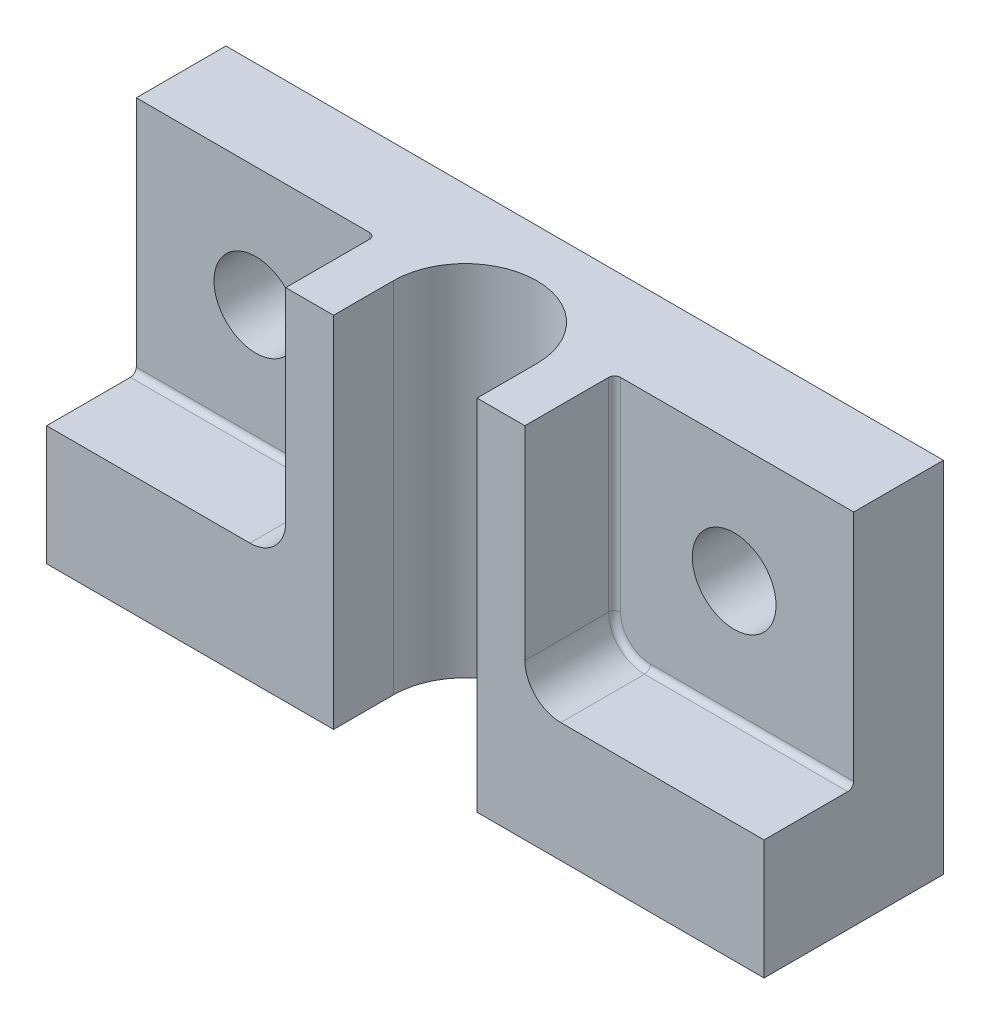
ISO-10303-21;
HEADER;
FILE_DESCRIPTION(('STEP AP214'),'2;1');
FILE_NAME('part.step','',(''),(''),'','','');
FILE_SCHEMA(('AUTOMOTIVE_DESIGN { 1 0 10303 214 1 1 1 1 }'));
ENDSEC;
DATA;
#1=APPLICATION_CONTEXT('core data for automotive mechanical design processes');
#2=APPLICATION_PROTOCOL_DEFINITION('international standard','automotive_design',2000,#1);
#3=PRODUCT_CONTEXT('',#1,'mechanical');
#4=PRODUCT('Part','Part','',(#3));
#5=PRODUCT_RELATED_PRODUCT_CATEGORY('part','',(#4));
#6=PRODUCT_DEFINITION_FORMATION('','',#4);
#7=PRODUCT_DEFINITION_CONTEXT('part definition',#1,'design');
#8=PRODUCT_DEFINITION('design','',#6,#7);
#9=PRODUCT_DEFINITION_SHAPE('','',#8);
#10=(LENGTH_UNIT() NAMED_UNIT(*) SI_UNIT(.MILLI.,.METRE.));
#11=(NAMED_UNIT(*) PLANE_ANGLE_UNIT() SI_UNIT($,.RADIAN.));
#12=(NAMED_UNIT(*) SI_UNIT($,.STERADIAN.) SOLID_ANGLE_UNIT());
#13=UNCERTAINTY_MEASURE_WITH_UNIT(LENGTH_MEASURE(1.E-05),#10,'distance_accuracy_value','');
#14=(GEOMETRIC_REPRESENTATION_CONTEXT(3) GLOBAL_UNCERTAINTY_ASSIGNED_CONTEXT((#13)) GLOBAL_UNIT_ASSIGNED_CONTEXT((#10,
#11,#12)) REPRESENTATION_CONTEXT('',''));
#15=CARTESIAN_POINT('',(0.,0.,0.));
#16=DIRECTION('',(0.,0.,1.));
#17=DIRECTION('',(1.,0.,0.));
#18=AXIS2_PLACEMENT_3D('',#15,#16,#17);
#19=CARTESIAN_POINT('',(-30.,-30.,0.));
#20=DIRECTION('',(0.,0.,1.));
#21=DIRECTION('',(1.,0.,0.));
#22=AXIS2_PLACEMENT_3D('',#19,#20,#21);
#23=PLANE('',#22);
#24=DIRECTION('',(0.,1.,0.));
#25=VECTOR('',#24,1.);
#26=CARTESIAN_POINT('',(-6.,-30.,0.));
#27=LINE('',#26,#25);
#28=CARTESIAN_POINT('',(-6.,-30.,0.));
#29=VERTEX_POINT('',#28);
#30=CARTESIAN_POINT('',(-6.,0.,0.));
#31=VERTEX_POINT('',#30);
#32=EDGE_CURVE('E211',#29,#31,#27,.T.);
#33=ORIENTED_EDGE('',*,*,#32,.T.);
#34=DIRECTION('',(-1.,0.,0.));
#35=VECTOR('',#34,1.);
#36=CARTESIAN_POINT('',(-30.,0.,0.));
#37=LINE('',#36,#35);
#38=CARTESIAN_POINT('',(-10.,0.,0.));
#39=VERTEX_POINT('',#38);
#40=EDGE_CURVE('E290',#31,#39,#37,.T.);
#41=ORIENTED_EDGE('',*,*,#40,.T.);
#42=DIRECTION('',(0.,1.,0.));
#43=VECTOR('',#42,1.);
#44=CARTESIAN_POINT('',(-10.,-17.,0.));
#45=LINE('',#44,#43);
#46=CARTESIAN_POINT('',(-10.,-17.,0.));
#47=VERTEX_POINT('',#46);
#48=EDGE_CURVE('E226',#47,#39,#45,.T.);
#49=ORIENTED_EDGE('',*,*,#48,.F.);
#50=CARTESIAN_POINT('',(-13.,-17.,0.));
#51=DIRECTION('',(0.,0.,1.));
#52=DIRECTION('',(1.,0.,0.));
#53=AXIS2_PLACEMENT_3D('',#50,#51,#52);
#54=CIRCLE('',#53,3.);
#55=CARTESIAN_POINT('',(-13.,-20.,0.));
#56=VERTEX_POINT('',#55);
#57=EDGE_CURVE('E214',#56,#47,#54,.T.);
#58=ORIENTED_EDGE('',*,*,#57,.F.);
#59=DIRECTION('',(1.,0.,0.));
#60=VECTOR('',#59,1.);
#61=CARTESIAN_POINT('',(-13.,-20.,0.));
#62=LINE('',#61,#60);
#63=CARTESIAN_POINT('',(-30.,-20.,0.));
#64=VERTEX_POINT('',#63);
#65=EDGE_CURVE('E220',#64,#56,#62,.T.);
#66=ORIENTED_EDGE('',*,*,#65,.F.);
#67=DIRECTION('',(0.,-1.,0.));
#68=VECTOR('',#67,1.);
#69=CARTESIAN_POINT('',(-30.,0.,0.));
#70=LINE('',#69,#68);
#71=CARTESIAN_POINT('',(-30.,-30.,0.));
#72=VERTEX_POINT('',#71);
#73=EDGE_CURVE('E268',#64,#72,#70,.T.);
#74=ORIENTED_EDGE('',*,*,#73,.T.);
#75=DIRECTION('',(1.,0.,0.));
#76=VECTOR('',#75,1.);
#77=CARTESIAN_POINT('',(-30.,-30.,0.));
#78=LINE('',#77,#76);
#79=EDGE_CURVE('E284',#72,#29,#78,.T.);
#80=ORIENTED_EDGE('',*,*,#79,.T.);
#81=EDGE_LOOP('',(#33,#41,#49,#58,#66,#74,#80));
#82=FACE_BOUND('',#81,.T.);
#83=ADVANCED_FACE('F38',(#82),#23,.T.);
#84=CARTESIAN_POINT('',(-20.,-10.0000000000003,-15.));
#85=DIRECTION('',(0.,0.,1.));
#86=DIRECTION('',(1.,0.,0.));
#87=AXIS2_PLACEMENT_3D('',#84,#85,#86);
#88=CYLINDRICAL_SURFACE('',#87,3.5);
#89=CARTESIAN_POINT('',(-20.,-10.0000000000003,-15.));
#90=DIRECTION('',(0.,0.,1.));
#91=DIRECTION('',(1.,0.,0.));
#92=AXIS2_PLACEMENT_3D('',#89,#90,#91);
#93=CIRCLE('',#92,3.5);
#94=CARTESIAN_POINT('',(-16.5,-10.0000000000003,-15.));
#95=VERTEX_POINT('',#94);
#96=EDGE_CURVE('E262',#95,#95,#93,.T.);
#97=ORIENTED_EDGE('',*,*,#96,.F.);
#98=EDGE_LOOP('',(#97));
#99=FACE_BOUND('',#98,.T.);
#100=CARTESIAN_POINT('',(-20.,-10.0000000000003,-7.5));
#101=DIRECTION('',(0.,0.,1.));
#102=DIRECTION('',(1.,0.,0.));
#103=AXIS2_PLACEMENT_3D('',#100,#101,#102);
#104=CIRCLE('',#103,3.5);
#105=CARTESIAN_POINT('',(-16.5,-10.0000000000003,-7.5));
#106=VERTEX_POINT('',#105);
#107=EDGE_CURVE('E233',#106,#106,#104,.F.);
#108=ORIENTED_EDGE('',*,*,#107,.F.);
#109=EDGE_LOOP('',(#108));
#110=FACE_BOUND('',#109,.T.);
#111=ADVANCED_FACE('F434',(#99,#110),#88,.F.);
#112=CARTESIAN_POINT('',(-30.,0.,-15.));
#113=DIRECTION('',(-1.,0.,0.));
#114=DIRECTION('',(0.,-1.,0.));
#115=AXIS2_PLACEMENT_3D('',#112,#113,#114);
#116=PLANE('',#115);
#117=DIRECTION('',(0.,0.,1.));
#118=VECTOR('',#117,1.);
#119=CARTESIAN_POINT('',(-30.,-20.,-7.5));
#120=LINE('',#119,#118);
#121=CARTESIAN_POINT('',(-30.,-20.,-7.));
#122=VERTEX_POINT('',#121);
#123=EDGE_CURVE('E234',#122,#64,#120,.T.);
#124=ORIENTED_EDGE('',*,*,#123,.F.);
#125=CARTESIAN_POINT('',(-30.,-19.5,-7.));
#126=DIRECTION('',(-1.,0.,0.));
#127=DIRECTION('',(0.,-1.,0.));
#128=AXIS2_PLACEMENT_3D('',#125,#126,#127);
#129=CIRCLE('',#128,0.5);
#130=CARTESIAN_POINT('',(-30.,-19.5,-7.5));
#131=VERTEX_POINT('',#130);
#132=EDGE_CURVE('E47',#122,#131,#129,.F.);
#133=ORIENTED_EDGE('',*,*,#132,.T.);
#134=DIRECTION('',(0.,-1.,0.));
#135=VECTOR('',#134,1.);
#136=CARTESIAN_POINT('',(-30.,-20.,-7.5));
#137=LINE('',#136,#135);
#138=CARTESIAN_POINT('',(-30.,0.,-7.5));
#139=VERTEX_POINT('',#138);
#140=EDGE_CURVE('E219',#139,#131,#137,.T.);
#141=ORIENTED_EDGE('',*,*,#140,.F.);
#142=DIRECTION('',(0.,0.,1.));
#143=VECTOR('',#142,1.);
#144=CARTESIAN_POINT('',(-30.,0.,-15.));
#145=LINE('',#144,#143);
#146=CARTESIAN_POINT('',(-30.,0.,-15.));
#147=VERTEX_POINT('',#146);
#148=EDGE_CURVE('E293',#147,#139,#145,.T.);
#149=ORIENTED_EDGE('',*,*,#148,.F.);
#150=DIRECTION('',(0.,-1.,0.));
#151=VECTOR('',#150,1.);
#152=CARTESIAN_POINT('',(-30.,0.,-15.));
#153=LINE('',#152,#151);
#154=CARTESIAN_POINT('',(-30.,-30.,-15.));
#155=VERTEX_POINT('',#154);
#156=EDGE_CURVE('E269',#147,#155,#153,.T.);
#157=ORIENTED_EDGE('',*,*,#156,.T.);
#158=DIRECTION('',(0.,0.,1.));
#159=VECTOR('',#158,1.);
#160=CARTESIAN_POINT('',(-30.,-30.,-15.));
#161=LINE('',#160,#159);
#162=EDGE_CURVE('E282',#155,#72,#161,.T.);
#163=ORIENTED_EDGE('',*,*,#162,.T.);
#164=ORIENTED_EDGE('',*,*,#73,.F.);
#165=EDGE_LOOP('',(#124,#133,#141,#149,#157,#163,#164));
#166=FACE_BOUND('',#165,.T.);
#167=ADVANCED_FACE('F389',(#166),#116,.T.);
#168=CARTESIAN_POINT('',(-30.,0.,-15.));
#169=DIRECTION('',(0.,1.,0.));
#170=DIRECTION('',(0.,0.,1.));
#171=AXIS2_PLACEMENT_3D('',#168,#169,#170);
#172=PLANE('',#171);
#173=DIRECTION('',(0.,0.,1.));
#174=VECTOR('',#173,1.);
#175=CARTESIAN_POINT('',(-6.,0.,0.));
#176=LINE('',#175,#174);
#177=CARTESIAN_POINT('',(-6.,0.,-5.));
#178=VERTEX_POINT('',#177);
#179=EDGE_CURVE('E202',#178,#31,#176,.T.);
#180=ORIENTED_EDGE('',*,*,#179,.F.);
#181=CARTESIAN_POINT('',(0.,0.,-5.));
#182=DIRECTION('',(0.,1.,0.));
#183=DIRECTION('',(0.,0.,1.));
#184=AXIS2_PLACEMENT_3D('',#181,#182,#183);
#185=CIRCLE('',#184,6.);
#186=CARTESIAN_POINT('',(6.,0.,-5.));
#187=VERTEX_POINT('',#186);
#188=EDGE_CURVE('E204',#187,#178,#185,.T.);
#189=ORIENTED_EDGE('',*,*,#188,.F.);
#190=DIRECTION('',(0.,0.,-1.));
#191=VECTOR('',#190,1.);
#192=CARTESIAN_POINT('',(6.,0.,0.));
#193=LINE('',#192,#191);
#194=CARTESIAN_POINT('',(6.,0.,0.));
#195=VERTEX_POINT('',#194);
#196=EDGE_CURVE('E183',#195,#187,#193,.T.);
#197=ORIENTED_EDGE('',*,*,#196,.F.);
#198=CARTESIAN_POINT('',(10.,0.,0.));
#199=VERTEX_POINT('',#198);
#200=EDGE_CURVE('E273',#199,#195,#37,.T.);
#201=ORIENTED_EDGE('',*,*,#200,.F.);
#202=DIRECTION('',(0.,0.,1.));
#203=VECTOR('',#202,1.);
#204=CARTESIAN_POINT('',(10.,0.,-7.5));
#205=LINE('',#204,#203);
#206=CARTESIAN_POINT('',(10.,0.,-7.));
#207=VERTEX_POINT('',#206);
#208=EDGE_CURVE('E245',#207,#199,#205,.T.);
#209=ORIENTED_EDGE('',*,*,#208,.F.);
#210=CARTESIAN_POINT('',(10.5,0.,-7.));
#211=DIRECTION('',(0.,1.,0.));
#212=DIRECTION('',(0.,0.,1.));
#213=AXIS2_PLACEMENT_3D('',#210,#211,#212);
#214=CIRCLE('',#213,0.5);
#215=CARTESIAN_POINT('',(10.5,0.,-7.5));
#216=VERTEX_POINT('',#215);
#217=EDGE_CURVE('E334',#207,#216,#214,.F.);
#218=ORIENTED_EDGE('',*,*,#217,.T.);
#219=DIRECTION('',(-1.,0.,0.));
#220=VECTOR('',#219,1.);
#221=CARTESIAN_POINT('',(10.,0.,-7.5));
#222=LINE('',#221,#220);
#223=CARTESIAN_POINT('',(30.,0.,-7.5));
#224=VERTEX_POINT('',#223);
#225=EDGE_CURVE('E241',#224,#216,#222,.T.);
#226=ORIENTED_EDGE('',*,*,#225,.F.);
#227=DIRECTION('',(0.,0.,1.));
#228=VECTOR('',#227,1.);
#229=CARTESIAN_POINT('',(30.,0.,-15.));
#230=LINE('',#229,#228);
#231=CARTESIAN_POINT('',(30.,0.,-15.));
#232=VERTEX_POINT('',#231);
#233=EDGE_CURVE('E297',#232,#224,#230,.T.);
#234=ORIENTED_EDGE('',*,*,#233,.F.);
#235=DIRECTION('',(-1.,0.,0.));
#236=VECTOR('',#235,1.);
#237=CARTESIAN_POINT('',(-30.,0.,-15.));
#238=LINE('',#237,#236);
#239=EDGE_CURVE('E279',#232,#147,#238,.T.);
#240=ORIENTED_EDGE('',*,*,#239,.T.);
#241=ORIENTED_EDGE('',*,*,#148,.T.);
#242=DIRECTION('',(-1.,0.,0.));
#243=VECTOR('',#242,1.);
#244=CARTESIAN_POINT('',(-10.,0.,-7.5));
#245=LINE('',#244,#243);
#246=CARTESIAN_POINT('',(-10.5,0.,-7.5));
#247=VERTEX_POINT('',#246);
#248=EDGE_CURVE('E217',#247,#139,#245,.T.);
#249=ORIENTED_EDGE('',*,*,#248,.F.);
#250=CARTESIAN_POINT('',(-10.5,0.,-7.));
#251=DIRECTION('',(0.,1.,0.));
#252=DIRECTION('',(0.,0.,1.));
#253=AXIS2_PLACEMENT_3D('',#250,#251,#252);
#254=CIRCLE('',#253,0.5);
#255=CARTESIAN_POINT('',(-10.,0.,-7.));
#256=VERTEX_POINT('',#255);
#257=EDGE_CURVE('E332',#247,#256,#254,.F.);
#258=ORIENTED_EDGE('',*,*,#257,.T.);
#259=DIRECTION('',(0.,0.,1.));
#260=VECTOR('',#259,1.);
#261=CARTESIAN_POINT('',(-10.,0.,-7.5));
#262=LINE('',#261,#260);
#263=EDGE_CURVE('E236',#256,#39,#262,.T.);
#264=ORIENTED_EDGE('',*,*,#263,.T.);
#265=ORIENTED_EDGE('',*,*,#40,.F.);
#266=EDGE_LOOP('',(#180,#189,#197,#201,#209,#218,#226,#234,#240,#241,#249,#258,#264,#265));
#267=FACE_BOUND('',#266,.T.);
#268=ADVANCED_FACE('F364',(#267),#172,.T.);
#269=CARTESIAN_POINT('',(30.,0.,-15.));
#270=DIRECTION('',(1.,0.,0.));
#271=DIRECTION('',(0.,1.,0.));
#272=AXIS2_PLACEMENT_3D('',#269,#270,#271);
#273=PLANE('',#272);
#274=DIRECTION('',(0.,1.,0.));
#275=VECTOR('',#274,1.);
#276=CARTESIAN_POINT('',(30.,-20.,-7.5));
#277=LINE('',#276,#275);
#278=CARTESIAN_POINT('',(30.,-19.5,-7.5));
#279=VERTEX_POINT('',#278);
#280=EDGE_CURVE('E239',#279,#224,#277,.T.);
#281=ORIENTED_EDGE('',*,*,#280,.F.);
#282=CARTESIAN_POINT('',(30.,-19.5,-7.));
#283=DIRECTION('',(1.,0.,0.));
#284=DIRECTION('',(0.,1.,0.));
#285=AXIS2_PLACEMENT_3D('',#282,#283,#284);
#286=CIRCLE('',#285,0.5);
#287=CARTESIAN_POINT('',(30.,-20.,-7.));
#288=VERTEX_POINT('',#287);
#289=EDGE_CURVE('E11',#279,#288,#286,.F.);
#290=ORIENTED_EDGE('',*,*,#289,.T.);
#291=DIRECTION('',(0.,0.,1.));
#292=VECTOR('',#291,1.);
#293=CARTESIAN_POINT('',(30.,-20.,-7.5));
#294=LINE('',#293,#292);
#295=CARTESIAN_POINT('',(30.,-20.,0.));
#296=VERTEX_POINT('',#295);
#297=EDGE_CURVE('E254',#288,#296,#294,.T.);
#298=ORIENTED_EDGE('',*,*,#297,.T.);
#299=DIRECTION('',(0.,1.,0.));
#300=VECTOR('',#299,1.);
#301=CARTESIAN_POINT('',(30.,0.,0.));
#302=LINE('',#301,#300);
#303=CARTESIAN_POINT('',(30.,-30.,0.));
#304=VERTEX_POINT('',#303);
#305=EDGE_CURVE('E287',#304,#296,#302,.T.);
#306=ORIENTED_EDGE('',*,*,#305,.F.);
#307=DIRECTION('',(0.,0.,1.));
#308=VECTOR('',#307,1.);
#309=CARTESIAN_POINT('',(30.,-30.,-15.));
#310=LINE('',#309,#308);
#311=CARTESIAN_POINT('',(30.,-30.,-15.));
#312=VERTEX_POINT('',#311);
#313=EDGE_CURVE('E300',#312,#304,#310,.T.);
#314=ORIENTED_EDGE('',*,*,#313,.F.);
#315=DIRECTION('',(0.,1.,0.));
#316=VECTOR('',#315,1.);
#317=CARTESIAN_POINT('',(30.,0.,-15.));
#318=LINE('',#317,#316);
#319=EDGE_CURVE('E276',#312,#232,#318,.T.);
#320=ORIENTED_EDGE('',*,*,#319,.T.);
#321=ORIENTED_EDGE('',*,*,#233,.T.);
#322=EDGE_LOOP('',(#281,#290,#298,#306,#314,#320,#321));
#323=FACE_BOUND('',#322,.T.);
#324=ADVANCED_FACE('F359',(#323),#273,.T.);
#325=CARTESIAN_POINT('',(-30.,-30.,-15.));
#326=DIRECTION('',(0.,-1.,0.));
#327=DIRECTION('',(0.,0.,-1.));
#328=AXIS2_PLACEMENT_3D('',#325,#326,#327);
#329=PLANE('',#328);
#330=DIRECTION('',(0.,0.,1.));
#331=VECTOR('',#330,1.);
#332=CARTESIAN_POINT('',(-6.,-30.,0.));
#333=LINE('',#332,#331);
#334=CARTESIAN_POINT('',(-6.,-30.,-5.));
#335=VERTEX_POINT('',#334);
#336=EDGE_CURVE('E196',#335,#29,#333,.T.);
#337=ORIENTED_EDGE('',*,*,#336,.T.);
#338=ORIENTED_EDGE('',*,*,#79,.F.);
#339=ORIENTED_EDGE('',*,*,#162,.F.);
#340=DIRECTION('',(1.,0.,0.));
#341=VECTOR('',#340,1.);
#342=CARTESIAN_POINT('',(-30.,-30.,-15.));
#343=LINE('',#342,#341);
#344=EDGE_CURVE('E272',#155,#312,#343,.T.);
#345=ORIENTED_EDGE('',*,*,#344,.T.);
#346=ORIENTED_EDGE('',*,*,#313,.T.);
#347=CARTESIAN_POINT('',(5.99999999999999,-30.,0.));
#348=VERTEX_POINT('',#347);
#349=EDGE_CURVE('E201',#348,#304,#78,.T.);
#350=ORIENTED_EDGE('',*,*,#349,.F.);
#351=DIRECTION('',(0.,0.,-1.));
#352=VECTOR('',#351,1.);
#353=CARTESIAN_POINT('',(6.,-30.,0.));
#354=LINE('',#353,#352);
#355=CARTESIAN_POINT('',(6.,-30.,-5.));
#356=VERTEX_POINT('',#355);
#357=EDGE_CURVE('E180',#348,#356,#354,.T.);
#358=ORIENTED_EDGE('',*,*,#357,.T.);
#359=CARTESIAN_POINT('',(0.,-30.,-5.));
#360=DIRECTION('',(0.,1.,0.));
#361=DIRECTION('',(0.,0.,1.));
#362=AXIS2_PLACEMENT_3D('',#359,#360,#361);
#363=CIRCLE('',#362,6.);
#364=EDGE_CURVE('E191',#356,#335,#363,.T.);
#365=ORIENTED_EDGE('',*,*,#364,.T.);
#366=EDGE_LOOP('',(#337,#338,#339,#345,#346,#350,#358,#365));
#367=FACE_BOUND('',#366,.T.);
#368=ADVANCED_FACE('F199',(#367),#329,.T.);
#369=CARTESIAN_POINT('',(-30.,-30.,-15.));
#370=DIRECTION('',(0.,0.,1.));
#371=DIRECTION('',(1.,0.,0.));
#372=AXIS2_PLACEMENT_3D('',#369,#370,#371);
#373=PLANE('',#372);
#374=ORIENTED_EDGE('',*,*,#96,.T.);
#375=EDGE_LOOP('',(#374));
#376=FACE_BOUND('',#375,.T.);
#377=CARTESIAN_POINT('',(20.,-10.,-15.));
#378=DIRECTION('',(0.,0.,1.));
#379=DIRECTION('',(1.,0.,0.));
#380=AXIS2_PLACEMENT_3D('',#377,#378,#379);
#381=CIRCLE('',#380,3.5);
#382=CARTESIAN_POINT('',(23.5,-10.,-15.));
#383=VERTEX_POINT('',#382);
#384=EDGE_CURVE('E265',#383,#383,#381,.T.);
#385=ORIENTED_EDGE('',*,*,#384,.T.);
#386=EDGE_LOOP('',(#385));
#387=FACE_BOUND('',#386,.T.);
#388=ORIENTED_EDGE('',*,*,#156,.F.);
#389=ORIENTED_EDGE('',*,*,#239,.F.);
#390=ORIENTED_EDGE('',*,*,#319,.F.);
#391=ORIENTED_EDGE('',*,*,#344,.F.);
#392=EDGE_LOOP('',(#388,#389,#390,#391));
#393=FACE_BOUND('',#392,.T.);
#394=ADVANCED_FACE('F387',(#376,#387,#393),#373,.F.);
#395=DIRECTION('',(0.,1.,0.));
#396=VECTOR('',#395,1.);
#397=CARTESIAN_POINT('',(6.,-30.,0.));
#398=LINE('',#397,#396);
#399=EDGE_CURVE('E188',#348,#195,#398,.T.);
#400=ORIENTED_EDGE('',*,*,#399,.F.);
#401=ORIENTED_EDGE('',*,*,#349,.T.);
#402=ORIENTED_EDGE('',*,*,#305,.T.);
#403=DIRECTION('',(1.,0.,0.));
#404=VECTOR('',#403,1.);
#405=CARTESIAN_POINT('',(13.,-20.,0.));
#406=LINE('',#405,#404);
#407=CARTESIAN_POINT('',(13.,-20.,0.));
#408=VERTEX_POINT('',#407);
#409=EDGE_CURVE('E242',#408,#296,#406,.T.);
#410=ORIENTED_EDGE('',*,*,#409,.F.);
#411=CARTESIAN_POINT('',(13.,-17.,0.));
#412=DIRECTION('',(0.,0.,1.));
#413=DIRECTION('',(-1.,0.,0.));
#414=AXIS2_PLACEMENT_3D('',#411,#412,#413);
#415=CIRCLE('',#414,3.);
#416=CARTESIAN_POINT('',(10.,-17.,0.));
#417=VERTEX_POINT('',#416);
#418=EDGE_CURVE('E249',#417,#408,#415,.T.);
#419=ORIENTED_EDGE('',*,*,#418,.F.);
#420=DIRECTION('',(0.,-1.,0.));
#421=VECTOR('',#420,1.);
#422=CARTESIAN_POINT('',(10.,-17.,0.));
#423=LINE('',#422,#421);
#424=EDGE_CURVE('E246',#199,#417,#423,.T.);
#425=ORIENTED_EDGE('',*,*,#424,.F.);
#426=ORIENTED_EDGE('',*,*,#200,.T.);
#427=EDGE_LOOP('',(#400,#401,#402,#410,#419,#425,#426));
#428=FACE_BOUND('',#427,.T.);
#429=ADVANCED_FACE('F374',(#428),#23,.T.);
#430=CARTESIAN_POINT('',(20.,-10.,-15.));
#431=DIRECTION('',(0.,0.,1.));
#432=DIRECTION('',(1.,0.,0.));
#433=AXIS2_PLACEMENT_3D('',#430,#431,#432);
#434=CYLINDRICAL_SURFACE('',#433,3.5);
#435=CARTESIAN_POINT('',(20.,-10.,-7.5));
#436=DIRECTION('',(0.,0.,-1.));
#437=DIRECTION('',(-1.,0.,0.));
#438=AXIS2_PLACEMENT_3D('',#435,#436,#437);
#439=CIRCLE('',#438,3.5);
#440=CARTESIAN_POINT('',(16.5,-10.,-7.5));
#441=VERTEX_POINT('',#440);
#442=EDGE_CURVE('E256',#441,#441,#439,.F.);
#443=ORIENTED_EDGE('',*,*,#442,.T.);
#444=EDGE_LOOP('',(#443));
#445=FACE_BOUND('',#444,.T.);
#446=ORIENTED_EDGE('',*,*,#384,.F.);
#447=EDGE_LOOP('',(#446));
#448=FACE_BOUND('',#447,.T.);
#449=ADVANCED_FACE('F444',(#445,#448),#434,.F.);
#450=CARTESIAN_POINT('',(13.,-17.,-7.5));
#451=DIRECTION('',(0.,0.,-1.));
#452=DIRECTION('',(-1.,0.,0.));
#453=AXIS2_PLACEMENT_3D('',#450,#451,#452);
#454=PLANE('',#453);
#455=ORIENTED_EDGE('',*,*,#225,.T.);
#456=DIRECTION('',(0.,-1.,0.));
#457=VECTOR('',#456,1.);
#458=CARTESIAN_POINT('',(10.5,-17.,-7.5));
#459=LINE('',#458,#457);
#460=CARTESIAN_POINT('',(10.5,-17.,-7.5));
#461=VERTEX_POINT('',#460);
#462=EDGE_CURVE('E322',#216,#461,#459,.T.);
#463=ORIENTED_EDGE('',*,*,#462,.T.);
#464=CARTESIAN_POINT('',(13.,-17.,-7.5));
#465=DIRECTION('',(0.,0.,-1.));
#466=DIRECTION('',(-1.,0.,0.));
#467=AXIS2_PLACEMENT_3D('',#464,#465,#466);
#468=CIRCLE('',#467,2.5);
#469=CARTESIAN_POINT('',(13.,-19.5,-7.5));
#470=VERTEX_POINT('',#469);
#471=EDGE_CURVE('E320',#461,#470,#468,.F.);
#472=ORIENTED_EDGE('',*,*,#471,.T.);
#473=DIRECTION('',(1.,0.,0.));
#474=VECTOR('',#473,1.);
#475=CARTESIAN_POINT('',(30.,-19.5,-7.5));
#476=LINE('',#475,#474);
#477=EDGE_CURVE('E318',#470,#279,#476,.T.);
#478=ORIENTED_EDGE('',*,*,#477,.T.);
#479=ORIENTED_EDGE('',*,*,#280,.T.);
#480=EDGE_LOOP('',(#455,#463,#472,#478,#479));
#481=FACE_BOUND('',#480,.T.);
#482=ORIENTED_EDGE('',*,*,#442,.F.);
#483=EDGE_LOOP('',(#482));
#484=FACE_BOUND('',#483,.T.);
#485=ADVANCED_FACE('F356',(#481,#484),#454,.F.);
#486=CARTESIAN_POINT('',(13.,-20.,-7.5));
#487=DIRECTION('',(0.,-1.,0.));
#488=DIRECTION('',(0.,0.,-1.));
#489=AXIS2_PLACEMENT_3D('',#486,#487,#488);
#490=PLANE('',#489);
#491=ORIENTED_EDGE('',*,*,#297,.F.);
#492=DIRECTION('',(1.,0.,0.));
#493=VECTOR('',#492,1.);
#494=CARTESIAN_POINT('',(13.,-20.,-7.));
#495=LINE('',#494,#493);
#496=CARTESIAN_POINT('',(13.,-20.,-7.));
#497=VERTEX_POINT('',#496);
#498=EDGE_CURVE('E330',#288,#497,#495,.F.);
#499=ORIENTED_EDGE('',*,*,#498,.T.);
#500=DIRECTION('',(0.,0.,1.));
#501=VECTOR('',#500,1.);
#502=CARTESIAN_POINT('',(13.,-20.,-7.5));
#503=LINE('',#502,#501);
#504=EDGE_CURVE('E257',#497,#408,#503,.T.);
#505=ORIENTED_EDGE('',*,*,#504,.T.);
#506=ORIENTED_EDGE('',*,*,#409,.T.);
#507=EDGE_LOOP('',(#491,#499,#505,#506));
#508=FACE_BOUND('',#507,.T.);
#509=ADVANCED_FACE('F381',(#508),#490,.F.);
#510=CARTESIAN_POINT('',(13.,-17.,-7.5));
#511=DIRECTION('',(0.,0.,1.));
#512=DIRECTION('',(1.,0.,0.));
#513=AXIS2_PLACEMENT_3D('',#510,#511,#512);
#514=CYLINDRICAL_SURFACE('',#513,3.);
#515=ORIENTED_EDGE('',*,*,#504,.F.);
#516=CARTESIAN_POINT('',(13.,-17.,-7.));
#517=DIRECTION('',(0.,0.,-1.));
#518=DIRECTION('',(-1.,0.,0.));
#519=AXIS2_PLACEMENT_3D('',#516,#517,#518);
#520=CIRCLE('',#519,3.);
#521=CARTESIAN_POINT('',(10.,-17.,-7.));
#522=VERTEX_POINT('',#521);
#523=EDGE_CURVE('E327',#497,#522,#520,.T.);
#524=ORIENTED_EDGE('',*,*,#523,.T.);
#525=DIRECTION('',(0.,0.,1.));
#526=VECTOR('',#525,1.);
#527=CARTESIAN_POINT('',(10.,-17.,-7.5));
#528=LINE('',#527,#526);
#529=EDGE_CURVE('E259',#522,#417,#528,.T.);
#530=ORIENTED_EDGE('',*,*,#529,.T.);
#531=ORIENTED_EDGE('',*,*,#418,.T.);
#532=EDGE_LOOP('',(#515,#524,#530,#531));
#533=FACE_BOUND('',#532,.T.);
#534=ADVANCED_FACE('F379',(#533),#514,.F.);
#535=CARTESIAN_POINT('',(10.,-17.,-7.5));
#536=DIRECTION('',(-1.,0.,0.));
#537=DIRECTION('',(0.,0.,1.));
#538=AXIS2_PLACEMENT_3D('',#535,#536,#537);
#539=PLANE('',#538);
#540=ORIENTED_EDGE('',*,*,#529,.F.);
#541=DIRECTION('',(0.,-1.,0.));
#542=VECTOR('',#541,1.);
#543=CARTESIAN_POINT('',(10.,0.,-7.));
#544=LINE('',#543,#542);
#545=EDGE_CURVE('E325',#522,#207,#544,.F.);
#546=ORIENTED_EDGE('',*,*,#545,.T.);
#547=ORIENTED_EDGE('',*,*,#208,.T.);
#548=ORIENTED_EDGE('',*,*,#424,.T.);
#549=EDGE_LOOP('',(#540,#546,#547,#548));
#550=FACE_BOUND('',#549,.T.);
#551=ADVANCED_FACE('F370',(#550),#539,.F.);
#552=CARTESIAN_POINT('',(-13.,-17.,-7.5));
#553=DIRECTION('',(0.,0.,1.));
#554=DIRECTION('',(1.,0.,0.));
#555=AXIS2_PLACEMENT_3D('',#552,#553,#554);
#556=PLANE('',#555);
#557=CARTESIAN_POINT('',(-13.,-17.,-7.5));
#558=DIRECTION('',(0.,0.,1.));
#559=DIRECTION('',(1.,0.,0.));
#560=AXIS2_PLACEMENT_3D('',#557,#558,#559);
#561=CIRCLE('',#560,2.5);
#562=CARTESIAN_POINT('',(-13.,-19.5,-7.5));
#563=VERTEX_POINT('',#562);
#564=CARTESIAN_POINT('',(-10.5,-17.,-7.5));
#565=VERTEX_POINT('',#564);
#566=EDGE_CURVE('E309',#563,#565,#561,.T.);
#567=ORIENTED_EDGE('',*,*,#566,.T.);
#568=DIRECTION('',(0.,1.,0.));
#569=VECTOR('',#568,1.);
#570=CARTESIAN_POINT('',(-10.5,-17.,-7.5));
#571=LINE('',#570,#569);
#572=EDGE_CURVE('E311',#565,#247,#571,.T.);
#573=ORIENTED_EDGE('',*,*,#572,.T.);
#574=ORIENTED_EDGE('',*,*,#248,.T.);
#575=ORIENTED_EDGE('',*,*,#140,.T.);
#576=DIRECTION('',(1.,0.,0.));
#577=VECTOR('',#576,1.);
#578=CARTESIAN_POINT('',(-13.,-19.5,-7.5));
#579=LINE('',#578,#577);
#580=EDGE_CURVE('E296',#131,#563,#579,.T.);
#581=ORIENTED_EDGE('',*,*,#580,.T.);
#582=EDGE_LOOP('',(#567,#573,#574,#575,#581));
#583=FACE_BOUND('',#582,.T.);
#584=ORIENTED_EDGE('',*,*,#107,.T.);
#585=EDGE_LOOP('',(#584));
#586=FACE_BOUND('',#585,.T.);
#587=ADVANCED_FACE('F395',(#583,#586),#556,.T.);
#588=CARTESIAN_POINT('',(-13.,-17.,-7.5));
#589=DIRECTION('',(0.,0.,1.));
#590=DIRECTION('',(1.,0.,0.));
#591=AXIS2_PLACEMENT_3D('',#588,#589,#590);
#592=CYLINDRICAL_SURFACE('',#591,3.);
#593=DIRECTION('',(0.,0.,1.));
#594=VECTOR('',#593,1.);
#595=CARTESIAN_POINT('',(-10.,-17.,-7.5));
#596=LINE('',#595,#594);
#597=CARTESIAN_POINT('',(-10.,-17.,-7.));
#598=VERTEX_POINT('',#597);
#599=EDGE_CURVE('E223',#598,#47,#596,.T.);
#600=ORIENTED_EDGE('',*,*,#599,.F.);
#601=CARTESIAN_POINT('',(-13.,-17.,-7.));
#602=DIRECTION('',(0.,0.,1.));
#603=DIRECTION('',(1.,0.,0.));
#604=AXIS2_PLACEMENT_3D('',#601,#602,#603);
#605=CIRCLE('',#604,3.);
#606=CARTESIAN_POINT('',(-13.,-20.,-7.));
#607=VERTEX_POINT('',#606);
#608=EDGE_CURVE('E316',#598,#607,#605,.F.);
#609=ORIENTED_EDGE('',*,*,#608,.T.);
#610=DIRECTION('',(0.,0.,1.));
#611=VECTOR('',#610,1.);
#612=CARTESIAN_POINT('',(-13.,-20.,-7.5));
#613=LINE('',#612,#611);
#614=EDGE_CURVE('E231',#607,#56,#613,.T.);
#615=ORIENTED_EDGE('',*,*,#614,.T.);
#616=ORIENTED_EDGE('',*,*,#57,.T.);
#617=EDGE_LOOP('',(#600,#609,#615,#616));
#618=FACE_BOUND('',#617,.T.);
#619=ADVANCED_FACE('F409',(#618),#592,.F.);
#620=CARTESIAN_POINT('',(-13.,-20.,-7.5));
#621=DIRECTION('',(0.,-1.,0.));
#622=DIRECTION('',(0.,0.,-1.));
#623=AXIS2_PLACEMENT_3D('',#620,#621,#622);
#624=PLANE('',#623);
#625=ORIENTED_EDGE('',*,*,#614,.F.);
#626=DIRECTION('',(1.,0.,0.));
#627=VECTOR('',#626,1.);
#628=CARTESIAN_POINT('',(-13.,-20.,-7.));
#629=LINE('',#628,#627);
#630=EDGE_CURVE('E61',#607,#122,#629,.F.);
#631=ORIENTED_EDGE('',*,*,#630,.T.);
#632=ORIENTED_EDGE('',*,*,#123,.T.);
#633=ORIENTED_EDGE('',*,*,#65,.T.);
#634=EDGE_LOOP('',(#625,#631,#632,#633));
#635=FACE_BOUND('',#634,.T.);
#636=ADVANCED_FACE('F419',(#635),#624,.F.);
#637=CARTESIAN_POINT('',(-10.,-17.,-7.5));
#638=DIRECTION('',(1.,0.,0.));
#639=DIRECTION('',(0.,0.,-1.));
#640=AXIS2_PLACEMENT_3D('',#637,#638,#639);
#641=PLANE('',#640);
#642=ORIENTED_EDGE('',*,*,#263,.F.);
#643=DIRECTION('',(0.,1.,0.));
#644=VECTOR('',#643,1.);
#645=CARTESIAN_POINT('',(-10.,-17.,-7.));
#646=LINE('',#645,#644);
#647=EDGE_CURVE('E314',#256,#598,#646,.F.);
#648=ORIENTED_EDGE('',*,*,#647,.T.);
#649=ORIENTED_EDGE('',*,*,#599,.T.);
#650=ORIENTED_EDGE('',*,*,#48,.T.);
#651=EDGE_LOOP('',(#642,#648,#649,#650));
#652=FACE_BOUND('',#651,.T.);
#653=ADVANCED_FACE('F406',(#652),#641,.F.);
#654=CARTESIAN_POINT('',(-6.,-30.,0.));
#655=DIRECTION('',(-1.,0.,0.));
#656=DIRECTION('',(0.,0.,1.));
#657=AXIS2_PLACEMENT_3D('',#654,#655,#656);
#658=PLANE('',#657);
#659=ORIENTED_EDGE('',*,*,#179,.T.);
#660=ORIENTED_EDGE('',*,*,#32,.F.);
#661=ORIENTED_EDGE('',*,*,#336,.F.);
#662=DIRECTION('',(0.,1.,0.));
#663=VECTOR('',#662,1.);
#664=CARTESIAN_POINT('',(-6.,-30.,-5.));
#665=LINE('',#664,#663);
#666=EDGE_CURVE('E187',#335,#178,#665,.T.);
#667=ORIENTED_EDGE('',*,*,#666,.T.);
#668=EDGE_LOOP('',(#659,#660,#661,#667));
#669=FACE_BOUND('',#668,.T.);
#670=ADVANCED_FACE('F424',(#669),#658,.F.);
#671=CARTESIAN_POINT('',(0.,-30.,-5.));
#672=DIRECTION('',(0.,1.,0.));
#673=DIRECTION('',(0.,0.,1.));
#674=AXIS2_PLACEMENT_3D('',#671,#672,#673);
#675=CYLINDRICAL_SURFACE('',#674,6.);
#676=ORIENTED_EDGE('',*,*,#188,.T.);
#677=ORIENTED_EDGE('',*,*,#666,.F.);
#678=ORIENTED_EDGE('',*,*,#364,.F.);
#679=DIRECTION('',(0.,1.,0.));
#680=VECTOR('',#679,1.);
#681=CARTESIAN_POINT('',(6.,-30.,-5.));
#682=LINE('',#681,#680);
#683=EDGE_CURVE('E176',#356,#187,#682,.T.);
#684=ORIENTED_EDGE('',*,*,#683,.T.);
#685=EDGE_LOOP('',(#676,#677,#678,#684));
#686=FACE_BOUND('',#685,.T.);
#687=ADVANCED_FACE('F192',(#686),#675,.F.);
#688=CARTESIAN_POINT('',(6.,-30.,0.));
#689=DIRECTION('',(1.,0.,0.));
#690=DIRECTION('',(0.,0.,-1.));
#691=AXIS2_PLACEMENT_3D('',#688,#689,#690);
#692=PLANE('',#691);
#693=ORIENTED_EDGE('',*,*,#196,.T.);
#694=ORIENTED_EDGE('',*,*,#683,.F.);
#695=ORIENTED_EDGE('',*,*,#357,.F.);
#696=ORIENTED_EDGE('',*,*,#399,.T.);
#697=EDGE_LOOP('',(#693,#694,#695,#696));
#698=FACE_BOUND('',#697,.T.);
#699=ADVANCED_FACE('F178',(#698),#692,.F.);
#700=CARTESIAN_POINT('',(-13.,-19.5,-7.));
#701=DIRECTION('',(1.,0.,0.));
#702=DIRECTION('',(0.,0.,-1.));
#703=AXIS2_PLACEMENT_3D('',#700,#701,#702);
#704=CYLINDRICAL_SURFACE('',#703,0.5);
#705=ORIENTED_EDGE('',*,*,#132,.F.);
#706=ORIENTED_EDGE('',*,*,#630,.F.);
#707=CARTESIAN_POINT('',(-13.,-19.5,-7.));
#708=DIRECTION('',(-1.,0.,0.));
#709=DIRECTION('',(0.,-1.,0.));
#710=AXIS2_PLACEMENT_3D('',#707,#708,#709);
#711=CIRCLE('',#710,0.5);
#712=EDGE_CURVE('E209',#563,#607,#711,.T.);
#713=ORIENTED_EDGE('',*,*,#712,.F.);
#714=ORIENTED_EDGE('',*,*,#580,.F.);
#715=EDGE_LOOP('',(#705,#706,#713,#714));
#716=FACE_BOUND('',#715,.T.);
#717=ADVANCED_FACE('F417',(#716),#704,.F.);
#718=CARTESIAN_POINT('',(-13.,-17.,-7.));
#719=DIRECTION('',(0.,0.,1.));
#720=DIRECTION('',(1.,0.,0.));
#721=AXIS2_PLACEMENT_3D('',#718,#719,#720);
#722=TOROIDAL_SURFACE('',#721,2.5,0.5);
#723=ORIENTED_EDGE('',*,*,#712,.T.);
#724=ORIENTED_EDGE('',*,*,#608,.F.);
#725=CARTESIAN_POINT('',(-10.5,-17.,-7.));
#726=DIRECTION('',(0.,-1.,0.));
#727=DIRECTION('',(0.,0.,-1.));
#728=AXIS2_PLACEMENT_3D('',#725,#726,#727);
#729=CIRCLE('',#728,0.5);
#730=EDGE_CURVE('E337',#565,#598,#729,.T.);
#731=ORIENTED_EDGE('',*,*,#730,.F.);
#732=ORIENTED_EDGE('',*,*,#566,.F.);
#733=EDGE_LOOP('',(#723,#724,#731,#732));
#734=FACE_BOUND('',#733,.T.);
#735=ADVANCED_FACE('F413',(#734),#722,.F.);
#736=CARTESIAN_POINT('',(-10.5,-17.,-7.));
#737=DIRECTION('',(0.,1.,0.));
#738=DIRECTION('',(0.,0.,1.));
#739=AXIS2_PLACEMENT_3D('',#736,#737,#738);
#740=CYLINDRICAL_SURFACE('',#739,0.5);
#741=ORIENTED_EDGE('',*,*,#730,.T.);
#742=ORIENTED_EDGE('',*,*,#647,.F.);
#743=ORIENTED_EDGE('',*,*,#257,.F.);
#744=ORIENTED_EDGE('',*,*,#572,.F.);
#745=EDGE_LOOP('',(#741,#742,#743,#744));
#746=FACE_BOUND('',#745,.T.);
#747=ADVANCED_FACE('F402',(#746),#740,.F.);
#748=CARTESIAN_POINT('',(13.,-19.5,-7.));
#749=DIRECTION('',(-1.,0.,0.));
#750=DIRECTION('',(0.,0.,1.));
#751=AXIS2_PLACEMENT_3D('',#748,#749,#750);
#752=CYLINDRICAL_SURFACE('',#751,0.5);
#753=ORIENTED_EDGE('',*,*,#289,.F.);
#754=ORIENTED_EDGE('',*,*,#477,.F.);
#755=CARTESIAN_POINT('',(13.,-19.5,-7.));
#756=DIRECTION('',(1.,0.,0.));
#757=DIRECTION('',(0.,0.,-1.));
#758=AXIS2_PLACEMENT_3D('',#755,#756,#757);
#759=CIRCLE('',#758,0.5);
#760=EDGE_CURVE('E42',#497,#470,#759,.T.);
#761=ORIENTED_EDGE('',*,*,#760,.F.);
#762=ORIENTED_EDGE('',*,*,#498,.F.);
#763=EDGE_LOOP('',(#753,#754,#761,#762));
#764=FACE_BOUND('',#763,.T.);
#765=ADVANCED_FACE('F40',(#764),#752,.F.);
#766=CARTESIAN_POINT('',(13.,-17.,-7.));
#767=DIRECTION('',(0.,0.,-1.));
#768=DIRECTION('',(-1.,0.,0.));
#769=AXIS2_PLACEMENT_3D('',#766,#767,#768);
#770=TOROIDAL_SURFACE('',#769,2.5,0.5);
#771=ORIENTED_EDGE('',*,*,#760,.T.);
#772=ORIENTED_EDGE('',*,*,#471,.F.);
#773=CARTESIAN_POINT('',(10.5,-17.,-7.));
#774=DIRECTION('',(0.,-1.,0.));
#775=DIRECTION('',(0.,0.,-1.));
#776=AXIS2_PLACEMENT_3D('',#773,#774,#775);
#777=CIRCLE('',#776,0.5);
#778=EDGE_CURVE('E341',#522,#461,#777,.T.);
#779=ORIENTED_EDGE('',*,*,#778,.F.);
#780=ORIENTED_EDGE('',*,*,#523,.F.);
#781=EDGE_LOOP('',(#771,#772,#779,#780));
#782=FACE_BOUND('',#781,.T.);
#783=ADVANCED_FACE('F351',(#782),#770,.F.);
#784=CARTESIAN_POINT('',(10.5,-17.,-7.));
#785=DIRECTION('',(0.,1.,0.));
#786=DIRECTION('',(0.,0.,1.));
#787=AXIS2_PLACEMENT_3D('',#784,#785,#786);
#788=CYLINDRICAL_SURFACE('',#787,0.5);
#789=ORIENTED_EDGE('',*,*,#217,.F.);
#790=ORIENTED_EDGE('',*,*,#545,.F.);
#791=ORIENTED_EDGE('',*,*,#778,.T.);
#792=ORIENTED_EDGE('',*,*,#462,.F.);
#793=EDGE_LOOP('',(#789,#790,#791,#792));
#794=FACE_BOUND('',#793,.T.);
#795=ADVANCED_FACE('F367',(#794),#788,.F.);
#796=CLOSED_SHELL('',(#83,#111,#167,#268,#324,#368,#394,#429,#449,#485,#509,#534,#551,#587,#619,
#636,#653,#670,#687,#699,#717,#735,#747,#765,#783,#795));
#797=MANIFOLD_SOLID_BREP('B2',#796);
#798=ADVANCED_BREP_SHAPE_REPRESENTATION('',(#18,#797),#14);
#799=SHAPE_DEFINITION_REPRESENTATION(#9,#798);
ENDSEC;
END-ISO-10303-21;
